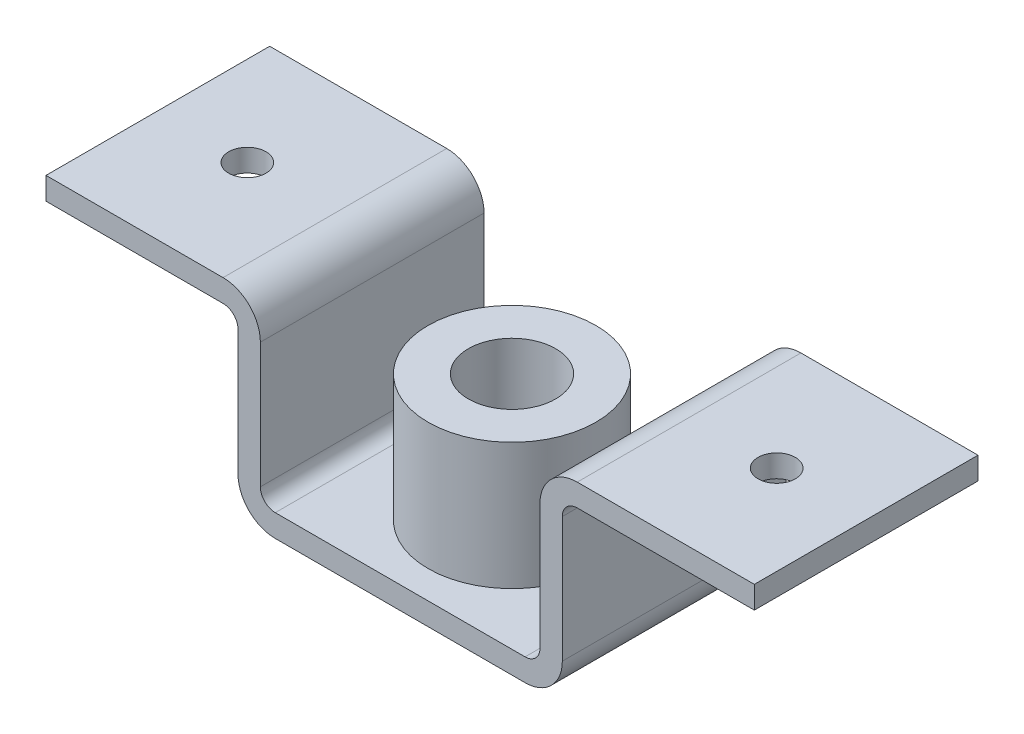
ISO-10303-21;
HEADER;
FILE_DESCRIPTION(('STEP AP214'),'2;1');
FILE_NAME('part.step','',(''),(''),'','','');
FILE_SCHEMA(('AUTOMOTIVE_DESIGN { 1 0 10303 214 1 1 1 1 }'));
ENDSEC;
DATA;
#1=APPLICATION_CONTEXT('core data for automotive mechanical design processes');
#2=APPLICATION_PROTOCOL_DEFINITION('international standard','automotive_design',2000,#1);
#3=PRODUCT_CONTEXT('',#1,'mechanical');
#4=PRODUCT('Part','Part','',(#3));
#5=PRODUCT_RELATED_PRODUCT_CATEGORY('part','',(#4));
#6=PRODUCT_DEFINITION_FORMATION('','',#4);
#7=PRODUCT_DEFINITION_CONTEXT('part definition',#1,'design');
#8=PRODUCT_DEFINITION('design','',#6,#7);
#9=PRODUCT_DEFINITION_SHAPE('','',#8);
#10=(LENGTH_UNIT() NAMED_UNIT(*) SI_UNIT(.MILLI.,.METRE.));
#11=(NAMED_UNIT(*) PLANE_ANGLE_UNIT() SI_UNIT($,.RADIAN.));
#12=(NAMED_UNIT(*) SI_UNIT($,.STERADIAN.) SOLID_ANGLE_UNIT());
#13=UNCERTAINTY_MEASURE_WITH_UNIT(LENGTH_MEASURE(1.E-05),#10,'distance_accuracy_value','');
#14=(GEOMETRIC_REPRESENTATION_CONTEXT(3) GLOBAL_UNCERTAINTY_ASSIGNED_CONTEXT((#13)) GLOBAL_UNIT_ASSIGNED_CONTEXT((#10,
#11,#12)) REPRESENTATION_CONTEXT('',''));
#15=CARTESIAN_POINT('',(0.,0.,0.));
#16=DIRECTION('',(0.,0.,1.));
#17=DIRECTION('',(1.,0.,0.));
#18=AXIS2_PLACEMENT_3D('',#15,#16,#17);
#19=CARTESIAN_POINT('',(-187.5,0.,150.));
#20=DIRECTION('',(-1.,0.,0.));
#21=DIRECTION('',(0.,0.,1.));
#22=AXIS2_PLACEMENT_3D('',#19,#20,#21);
#23=PLANE('',#22);
#24=DIRECTION('',(0.,1.,0.));
#25=VECTOR('',#24,1.);
#26=CARTESIAN_POINT('',(-187.5,0.,-150.));
#27=LINE('',#26,#25);
#28=CARTESIAN_POINT('',(-187.5,20.,-150.));
#29=VERTEX_POINT('',#28);
#30=CARTESIAN_POINT('',(-187.5,188.,-150.));
#31=VERTEX_POINT('',#30);
#32=EDGE_CURVE('E227',#29,#31,#27,.T.);
#33=ORIENTED_EDGE('',*,*,#32,.T.);
#34=DIRECTION('',(0.,0.,-1.));
#35=VECTOR('',#34,1.);
#36=CARTESIAN_POINT('',(-187.5,188.,150.));
#37=LINE('',#36,#35);
#38=CARTESIAN_POINT('',(-187.5,188.,150.));
#39=VERTEX_POINT('',#38);
#40=EDGE_CURVE('E322',#31,#39,#37,.F.);
#41=ORIENTED_EDGE('',*,*,#40,.T.);
#42=DIRECTION('',(0.,1.,0.));
#43=VECTOR('',#42,1.);
#44=CARTESIAN_POINT('',(-187.5,0.,150.));
#45=LINE('',#44,#43);
#46=CARTESIAN_POINT('',(-187.5,20.,150.));
#47=VERTEX_POINT('',#46);
#48=EDGE_CURVE('E188',#47,#39,#45,.T.);
#49=ORIENTED_EDGE('',*,*,#48,.F.);
#50=DIRECTION('',(0.,0.,-1.));
#51=VECTOR('',#50,1.);
#52=CARTESIAN_POINT('',(-187.5,20.,-150.));
#53=LINE('',#52,#51);
#54=EDGE_CURVE('E280',#47,#29,#53,.T.);
#55=ORIENTED_EDGE('',*,*,#54,.T.);
#56=EDGE_LOOP('',(#33,#41,#49,#55));
#57=FACE_BOUND('',#56,.T.);
#58=ADVANCED_FACE('F37',(#57),#23,.F.);
#59=CARTESIAN_POINT('',(-187.5,238.,150.));
#60=DIRECTION('',(0.,-1.,0.));
#61=DIRECTION('',(1.,0.,0.));
#62=AXIS2_PLACEMENT_3D('',#59,#60,#61);
#63=PLANE('',#62);
#64=CARTESIAN_POINT('',(-355.,238.,0.));
#65=DIRECTION('',(0.,1.,0.));
#66=DIRECTION('',(-1.,0.,0.));
#67=AXIS2_PLACEMENT_3D('',#64,#65,#66);
#68=CIRCLE('',#67,25.);
#69=CARTESIAN_POINT('',(-380.,238.,0.));
#70=VERTEX_POINT('',#69);
#71=EDGE_CURVE('E336',#70,#70,#68,.T.);
#72=ORIENTED_EDGE('',*,*,#71,.F.);
#73=EDGE_LOOP('',(#72));
#74=FACE_BOUND('',#73,.T.);
#75=DIRECTION('',(-1.,0.,0.));
#76=VECTOR('',#75,1.);
#77=CARTESIAN_POINT('',(-187.5,238.,150.));
#78=LINE('',#77,#76);
#79=CARTESIAN_POINT('',(-237.5,238.,150.));
#80=VERTEX_POINT('',#79);
#81=CARTESIAN_POINT('',(-475.,238.,150.));
#82=VERTEX_POINT('',#81);
#83=EDGE_CURVE('E174',#80,#82,#78,.T.);
#84=ORIENTED_EDGE('',*,*,#83,.F.);
#85=DIRECTION('',(0.,0.,-1.));
#86=VECTOR('',#85,1.);
#87=CARTESIAN_POINT('',(-237.5,238.,150.));
#88=LINE('',#87,#86);
#89=CARTESIAN_POINT('',(-237.5,238.,-150.));
#90=VERTEX_POINT('',#89);
#91=EDGE_CURVE('E320',#80,#90,#88,.T.);
#92=ORIENTED_EDGE('',*,*,#91,.T.);
#93=DIRECTION('',(-1.,0.,0.));
#94=VECTOR('',#93,1.);
#95=CARTESIAN_POINT('',(-187.5,238.,-150.));
#96=LINE('',#95,#94);
#97=CARTESIAN_POINT('',(-475.,238.,-150.));
#98=VERTEX_POINT('',#97);
#99=EDGE_CURVE('E194',#90,#98,#96,.T.);
#100=ORIENTED_EDGE('',*,*,#99,.T.);
#101=DIRECTION('',(0.,0.,-1.));
#102=VECTOR('',#101,1.);
#103=CARTESIAN_POINT('',(-475.,238.,150.));
#104=LINE('',#103,#102);
#105=EDGE_CURVE('E191',#82,#98,#104,.T.);
#106=ORIENTED_EDGE('',*,*,#105,.F.);
#107=EDGE_LOOP('',(#84,#92,#100,#106));
#108=FACE_BOUND('',#107,.T.);
#109=ADVANCED_FACE('F192',(#74,#108),#63,.F.);
#110=CARTESIAN_POINT('',(-475.,238.,150.));
#111=DIRECTION('',(1.,0.,0.));
#112=DIRECTION('',(0.,0.,-1.));
#113=AXIS2_PLACEMENT_3D('',#110,#111,#112);
#114=PLANE('',#113);
#115=DIRECTION('',(0.,-1.,0.));
#116=VECTOR('',#115,1.);
#117=CARTESIAN_POINT('',(-475.,238.,-150.));
#118=LINE('',#117,#116);
#119=CARTESIAN_POINT('',(-475.,208.,-150.));
#120=VERTEX_POINT('',#119);
#121=EDGE_CURVE('E232',#98,#120,#118,.T.);
#122=ORIENTED_EDGE('',*,*,#121,.T.);
#123=DIRECTION('',(0.,0.,-1.));
#124=VECTOR('',#123,1.);
#125=CARTESIAN_POINT('',(-475.,208.,150.));
#126=LINE('',#125,#124);
#127=CARTESIAN_POINT('',(-475.,208.,150.));
#128=VERTEX_POINT('',#127);
#129=EDGE_CURVE('E198',#128,#120,#126,.T.);
#130=ORIENTED_EDGE('',*,*,#129,.F.);
#131=DIRECTION('',(0.,-1.,0.));
#132=VECTOR('',#131,1.);
#133=CARTESIAN_POINT('',(-475.,238.,150.));
#134=LINE('',#133,#132);
#135=EDGE_CURVE('E180',#82,#128,#134,.T.);
#136=ORIENTED_EDGE('',*,*,#135,.F.);
#137=ORIENTED_EDGE('',*,*,#105,.T.);
#138=EDGE_LOOP('',(#122,#130,#136,#137));
#139=FACE_BOUND('',#138,.T.);
#140=ADVANCED_FACE('F200',(#139),#114,.F.);
#141=CARTESIAN_POINT('',(-217.5,208.,150.));
#142=DIRECTION('',(0.,1.,0.));
#143=DIRECTION('',(0.,0.,1.));
#144=AXIS2_PLACEMENT_3D('',#141,#142,#143);
#145=PLANE('',#144);
#146=CARTESIAN_POINT('',(-355.,208.,0.));
#147=DIRECTION('',(0.,1.,0.));
#148=DIRECTION('',(0.,0.,1.));
#149=AXIS2_PLACEMENT_3D('',#146,#147,#148);
#150=CIRCLE('',#149,25.);
#151=CARTESIAN_POINT('',(-355.,208.,25.));
#152=VERTEX_POINT('',#151);
#153=EDGE_CURVE('E230',#152,#152,#150,.T.);
#154=ORIENTED_EDGE('',*,*,#153,.T.);
#155=EDGE_LOOP('',(#154));
#156=FACE_BOUND('',#155,.T.);
#157=DIRECTION('',(1.,0.,0.));
#158=VECTOR('',#157,1.);
#159=CARTESIAN_POINT('',(-217.5,208.,-150.));
#160=LINE('',#159,#158);
#161=CARTESIAN_POINT('',(-237.5,208.,-150.));
#162=VERTEX_POINT('',#161);
#163=EDGE_CURVE('E234',#120,#162,#160,.T.);
#164=ORIENTED_EDGE('',*,*,#163,.T.);
#165=DIRECTION('',(0.,0.,-1.));
#166=VECTOR('',#165,1.);
#167=CARTESIAN_POINT('',(-237.5,208.,150.));
#168=LINE('',#167,#166);
#169=CARTESIAN_POINT('',(-237.5,208.,150.));
#170=VERTEX_POINT('',#169);
#171=EDGE_CURVE('E278',#162,#170,#168,.F.);
#172=ORIENTED_EDGE('',*,*,#171,.T.);
#173=DIRECTION('',(1.,0.,0.));
#174=VECTOR('',#173,1.);
#175=CARTESIAN_POINT('',(-217.5,208.,150.));
#176=LINE('',#175,#174);
#177=EDGE_CURVE('E203',#128,#170,#176,.T.);
#178=ORIENTED_EDGE('',*,*,#177,.F.);
#179=ORIENTED_EDGE('',*,*,#129,.T.);
#180=EDGE_LOOP('',(#164,#172,#178,#179));
#181=FACE_BOUND('',#180,.T.);
#182=ADVANCED_FACE('F357',(#156,#181),#145,.F.);
#183=CARTESIAN_POINT('',(-217.5,-30.,150.));
#184=DIRECTION('',(1.,0.,0.));
#185=DIRECTION('',(0.,0.,-1.));
#186=AXIS2_PLACEMENT_3D('',#183,#184,#185);
#187=PLANE('',#186);
#188=DIRECTION('',(0.,-1.,0.));
#189=VECTOR('',#188,1.);
#190=CARTESIAN_POINT('',(-217.5,-30.,-150.));
#191=LINE('',#190,#189);
#192=CARTESIAN_POINT('',(-217.5,188.,-150.));
#193=VERTEX_POINT('',#192);
#194=CARTESIAN_POINT('',(-217.5,20.,-150.));
#195=VERTEX_POINT('',#194);
#196=EDGE_CURVE('E237',#193,#195,#191,.T.);
#197=ORIENTED_EDGE('',*,*,#196,.T.);
#198=DIRECTION('',(0.,0.,-1.));
#199=VECTOR('',#198,1.);
#200=CARTESIAN_POINT('',(-217.5,20.,150.));
#201=LINE('',#200,#199);
#202=CARTESIAN_POINT('',(-217.5,20.,150.));
#203=VERTEX_POINT('',#202);
#204=EDGE_CURVE('E328',#195,#203,#201,.F.);
#205=ORIENTED_EDGE('',*,*,#204,.T.);
#206=DIRECTION('',(0.,-1.,0.));
#207=VECTOR('',#206,1.);
#208=CARTESIAN_POINT('',(-217.5,-30.,150.));
#209=LINE('',#208,#207);
#210=CARTESIAN_POINT('',(-217.5,188.,150.));
#211=VERTEX_POINT('',#210);
#212=EDGE_CURVE('E205',#211,#203,#209,.T.);
#213=ORIENTED_EDGE('',*,*,#212,.F.);
#214=DIRECTION('',(0.,0.,-1.));
#215=VECTOR('',#214,1.);
#216=CARTESIAN_POINT('',(-217.5,188.,-150.));
#217=LINE('',#216,#215);
#218=EDGE_CURVE('E275',#211,#193,#217,.T.);
#219=ORIENTED_EDGE('',*,*,#218,.T.);
#220=EDGE_LOOP('',(#197,#205,#213,#219));
#221=FACE_BOUND('',#220,.T.);
#222=ADVANCED_FACE('F366',(#221),#187,.F.);
#223=CARTESIAN_POINT('',(-217.5,-30.,150.));
#224=DIRECTION('',(0.,1.,0.));
#225=DIRECTION('',(0.,0.,1.));
#226=AXIS2_PLACEMENT_3D('',#223,#224,#225);
#227=PLANE('',#226);
#228=DIRECTION('',(1.,0.,0.));
#229=VECTOR('',#228,1.);
#230=CARTESIAN_POINT('',(-217.5,-30.,150.));
#231=LINE('',#230,#229);
#232=CARTESIAN_POINT('',(-167.5,-30.,150.));
#233=VERTEX_POINT('',#232);
#234=CARTESIAN_POINT('',(167.5,-30.,150.));
#235=VERTEX_POINT('',#234);
#236=EDGE_CURVE('E211',#233,#235,#231,.T.);
#237=ORIENTED_EDGE('',*,*,#236,.F.);
#238=DIRECTION('',(0.,0.,-1.));
#239=VECTOR('',#238,1.);
#240=CARTESIAN_POINT('',(-167.5,-30.,150.));
#241=LINE('',#240,#239);
#242=CARTESIAN_POINT('',(-167.5,-30.,-150.));
#243=VERTEX_POINT('',#242);
#244=EDGE_CURVE('E325',#233,#243,#241,.T.);
#245=ORIENTED_EDGE('',*,*,#244,.T.);
#246=DIRECTION('',(1.,0.,0.));
#247=VECTOR('',#246,1.);
#248=CARTESIAN_POINT('',(-217.5,-30.,-150.));
#249=LINE('',#248,#247);
#250=CARTESIAN_POINT('',(167.5,-30.,-150.));
#251=VERTEX_POINT('',#250);
#252=EDGE_CURVE('E240',#243,#251,#249,.T.);
#253=ORIENTED_EDGE('',*,*,#252,.T.);
#254=DIRECTION('',(0.,0.,-1.));
#255=VECTOR('',#254,1.);
#256=CARTESIAN_POINT('',(167.5,-30.,150.));
#257=LINE('',#256,#255);
#258=EDGE_CURVE('E60',#251,#235,#257,.F.);
#259=ORIENTED_EDGE('',*,*,#258,.T.);
#260=EDGE_LOOP('',(#237,#245,#253,#259));
#261=FACE_BOUND('',#260,.T.);
#262=ADVANCED_FACE('F373',(#261),#227,.F.);
#263=CARTESIAN_POINT('',(217.5,-30.,150.));
#264=DIRECTION('',(-1.,0.,0.));
#265=DIRECTION('',(0.,0.,1.));
#266=AXIS2_PLACEMENT_3D('',#263,#264,#265);
#267=PLANE('',#266);
#268=DIRECTION('',(0.,1.,0.));
#269=VECTOR('',#268,1.);
#270=CARTESIAN_POINT('',(217.5,-30.,150.));
#271=LINE('',#270,#269);
#272=CARTESIAN_POINT('',(217.5,20.,150.));
#273=VERTEX_POINT('',#272);
#274=CARTESIAN_POINT('',(217.5,188.,150.));
#275=VERTEX_POINT('',#274);
#276=EDGE_CURVE('E213',#273,#275,#271,.T.);
#277=ORIENTED_EDGE('',*,*,#276,.F.);
#278=DIRECTION('',(0.,0.,-1.));
#279=VECTOR('',#278,1.);
#280=CARTESIAN_POINT('',(217.5,20.,150.));
#281=LINE('',#280,#279);
#282=CARTESIAN_POINT('',(217.5,20.,-150.));
#283=VERTEX_POINT('',#282);
#284=EDGE_CURVE('E45',#273,#283,#281,.T.);
#285=ORIENTED_EDGE('',*,*,#284,.T.);
#286=DIRECTION('',(0.,1.,0.));
#287=VECTOR('',#286,1.);
#288=CARTESIAN_POINT('',(217.5,-30.,-150.));
#289=LINE('',#288,#287);
#290=CARTESIAN_POINT('',(217.5,188.,-150.));
#291=VERTEX_POINT('',#290);
#292=EDGE_CURVE('E242',#283,#291,#289,.T.);
#293=ORIENTED_EDGE('',*,*,#292,.T.);
#294=DIRECTION('',(0.,0.,-1.));
#295=VECTOR('',#294,1.);
#296=CARTESIAN_POINT('',(217.5,188.,150.));
#297=LINE('',#296,#295);
#298=EDGE_CURVE('E264',#291,#275,#297,.F.);
#299=ORIENTED_EDGE('',*,*,#298,.T.);
#300=EDGE_LOOP('',(#277,#285,#293,#299));
#301=FACE_BOUND('',#300,.T.);
#302=ADVANCED_FACE('F378',(#301),#267,.F.);
#303=CARTESIAN_POINT('',(217.5,208.,150.));
#304=DIRECTION('',(0.,1.,0.));
#305=DIRECTION('',(0.,0.,1.));
#306=AXIS2_PLACEMENT_3D('',#303,#304,#305);
#307=PLANE('',#306);
#308=CARTESIAN_POINT('',(355.,208.,0.));
#309=DIRECTION('',(0.,1.,0.));
#310=DIRECTION('',(0.,0.,1.));
#311=AXIS2_PLACEMENT_3D('',#308,#309,#310);
#312=CIRCLE('',#311,25.);
#313=CARTESIAN_POINT('',(355.,208.,25.));
#314=VERTEX_POINT('',#313);
#315=EDGE_CURVE('E332',#314,#314,#312,.T.);
#316=ORIENTED_EDGE('',*,*,#315,.T.);
#317=EDGE_LOOP('',(#316));
#318=FACE_BOUND('',#317,.T.);
#319=DIRECTION('',(1.,0.,0.));
#320=VECTOR('',#319,1.);
#321=CARTESIAN_POINT('',(217.5,208.,150.));
#322=LINE('',#321,#320);
#323=CARTESIAN_POINT('',(237.5,208.,150.));
#324=VERTEX_POINT('',#323);
#325=CARTESIAN_POINT('',(475.,208.,150.));
#326=VERTEX_POINT('',#325);
#327=EDGE_CURVE('E215',#324,#326,#322,.T.);
#328=ORIENTED_EDGE('',*,*,#327,.F.);
#329=DIRECTION('',(0.,0.,-1.));
#330=VECTOR('',#329,1.);
#331=CARTESIAN_POINT('',(237.5,208.,-150.));
#332=LINE('',#331,#330);
#333=CARTESIAN_POINT('',(237.5,208.,-150.));
#334=VERTEX_POINT('',#333);
#335=EDGE_CURVE('E197',#324,#334,#332,.T.);
#336=ORIENTED_EDGE('',*,*,#335,.T.);
#337=DIRECTION('',(1.,0.,0.));
#338=VECTOR('',#337,1.);
#339=CARTESIAN_POINT('',(217.5,208.,-150.));
#340=LINE('',#339,#338);
#341=CARTESIAN_POINT('',(475.,208.,-150.));
#342=VERTEX_POINT('',#341);
#343=EDGE_CURVE('E244',#334,#342,#340,.T.);
#344=ORIENTED_EDGE('',*,*,#343,.T.);
#345=DIRECTION('',(0.,0.,-1.));
#346=VECTOR('',#345,1.);
#347=CARTESIAN_POINT('',(475.,208.,150.));
#348=LINE('',#347,#346);
#349=EDGE_CURVE('E258',#326,#342,#348,.T.);
#350=ORIENTED_EDGE('',*,*,#349,.F.);
#351=EDGE_LOOP('',(#328,#336,#344,#350));
#352=FACE_BOUND('',#351,.T.);
#353=ADVANCED_FACE('F389',(#318,#352),#307,.F.);
#354=CARTESIAN_POINT('',(475.,238.,150.));
#355=DIRECTION('',(-1.,0.,0.));
#356=DIRECTION('',(0.,0.,1.));
#357=AXIS2_PLACEMENT_3D('',#354,#355,#356);
#358=PLANE('',#357);
#359=DIRECTION('',(0.,1.,0.));
#360=VECTOR('',#359,1.);
#361=CARTESIAN_POINT('',(475.,238.,-150.));
#362=LINE('',#361,#360);
#363=CARTESIAN_POINT('',(475.,238.,-150.));
#364=VERTEX_POINT('',#363);
#365=EDGE_CURVE('E246',#342,#364,#362,.T.);
#366=ORIENTED_EDGE('',*,*,#365,.T.);
#367=DIRECTION('',(0.,0.,-1.));
#368=VECTOR('',#367,1.);
#369=CARTESIAN_POINT('',(475.,238.,150.));
#370=LINE('',#369,#368);
#371=CARTESIAN_POINT('',(475.,238.,150.));
#372=VERTEX_POINT('',#371);
#373=EDGE_CURVE('E226',#372,#364,#370,.T.);
#374=ORIENTED_EDGE('',*,*,#373,.F.);
#375=DIRECTION('',(0.,1.,0.));
#376=VECTOR('',#375,1.);
#377=CARTESIAN_POINT('',(475.,238.,150.));
#378=LINE('',#377,#376);
#379=EDGE_CURVE('E217',#326,#372,#378,.T.);
#380=ORIENTED_EDGE('',*,*,#379,.F.);
#381=ORIENTED_EDGE('',*,*,#349,.T.);
#382=EDGE_LOOP('',(#366,#374,#380,#381));
#383=FACE_BOUND('',#382,.T.);
#384=ADVANCED_FACE('F393',(#383),#358,.F.);
#385=CARTESIAN_POINT('',(187.5,238.,150.));
#386=DIRECTION('',(0.,-1.,0.));
#387=DIRECTION('',(1.,0.,0.));
#388=AXIS2_PLACEMENT_3D('',#385,#386,#387);
#389=PLANE('',#388);
#390=CARTESIAN_POINT('',(355.,238.,0.));
#391=DIRECTION('',(0.,1.,0.));
#392=DIRECTION('',(1.,0.,0.));
#393=AXIS2_PLACEMENT_3D('',#390,#391,#392);
#394=CIRCLE('',#393,25.);
#395=CARTESIAN_POINT('',(380.,238.,0.));
#396=VERTEX_POINT('',#395);
#397=EDGE_CURVE('E341',#396,#396,#394,.T.);
#398=ORIENTED_EDGE('',*,*,#397,.F.);
#399=EDGE_LOOP('',(#398));
#400=FACE_BOUND('',#399,.T.);
#401=DIRECTION('',(-1.,0.,0.));
#402=VECTOR('',#401,1.);
#403=CARTESIAN_POINT('',(187.5,238.,-150.));
#404=LINE('',#403,#402);
#405=CARTESIAN_POINT('',(237.5,238.,-150.));
#406=VERTEX_POINT('',#405);
#407=EDGE_CURVE('E248',#364,#406,#404,.T.);
#408=ORIENTED_EDGE('',*,*,#407,.T.);
#409=DIRECTION('',(0.,0.,-1.));
#410=VECTOR('',#409,1.);
#411=CARTESIAN_POINT('',(237.5,238.,150.));
#412=LINE('',#411,#410);
#413=CARTESIAN_POINT('',(237.5,238.,150.));
#414=VERTEX_POINT('',#413);
#415=EDGE_CURVE('E312',#406,#414,#412,.F.);
#416=ORIENTED_EDGE('',*,*,#415,.T.);
#417=DIRECTION('',(-1.,0.,0.));
#418=VECTOR('',#417,1.);
#419=CARTESIAN_POINT('',(187.5,238.,150.));
#420=LINE('',#419,#418);
#421=EDGE_CURVE('E219',#372,#414,#420,.T.);
#422=ORIENTED_EDGE('',*,*,#421,.F.);
#423=ORIENTED_EDGE('',*,*,#373,.T.);
#424=EDGE_LOOP('',(#408,#416,#422,#423));
#425=FACE_BOUND('',#424,.T.);
#426=ADVANCED_FACE('F468',(#400,#425),#389,.F.);
#427=CARTESIAN_POINT('',(187.5,0.,150.));
#428=DIRECTION('',(1.,0.,0.));
#429=DIRECTION('',(0.,0.,-1.));
#430=AXIS2_PLACEMENT_3D('',#427,#428,#429);
#431=PLANE('',#430);
#432=DIRECTION('',(0.,-1.,0.));
#433=VECTOR('',#432,1.);
#434=CARTESIAN_POINT('',(187.5,0.,150.));
#435=LINE('',#434,#433);
#436=CARTESIAN_POINT('',(187.5,188.,150.));
#437=VERTEX_POINT('',#436);
#438=CARTESIAN_POINT('',(187.5,20.,150.));
#439=VERTEX_POINT('',#438);
#440=EDGE_CURVE('E221',#437,#439,#435,.T.);
#441=ORIENTED_EDGE('',*,*,#440,.F.);
#442=DIRECTION('',(0.,0.,-1.));
#443=VECTOR('',#442,1.);
#444=CARTESIAN_POINT('',(187.5,188.,150.));
#445=LINE('',#444,#443);
#446=CARTESIAN_POINT('',(187.5,188.,-150.));
#447=VERTEX_POINT('',#446);
#448=EDGE_CURVE('E301',#437,#447,#445,.T.);
#449=ORIENTED_EDGE('',*,*,#448,.T.);
#450=DIRECTION('',(0.,-1.,0.));
#451=VECTOR('',#450,1.);
#452=CARTESIAN_POINT('',(187.5,0.,-150.));
#453=LINE('',#452,#451);
#454=CARTESIAN_POINT('',(187.5,20.,-150.));
#455=VERTEX_POINT('',#454);
#456=EDGE_CURVE('E251',#447,#455,#453,.T.);
#457=ORIENTED_EDGE('',*,*,#456,.T.);
#458=DIRECTION('',(0.,0.,-1.));
#459=VECTOR('',#458,1.);
#460=CARTESIAN_POINT('',(187.5,20.,150.));
#461=LINE('',#460,#459);
#462=EDGE_CURVE('E272',#455,#439,#461,.F.);
#463=ORIENTED_EDGE('',*,*,#462,.T.);
#464=EDGE_LOOP('',(#441,#449,#457,#463));
#465=FACE_BOUND('',#464,.T.);
#466=ADVANCED_FACE('F403',(#465),#431,.F.);
#467=CARTESIAN_POINT('',(-187.5,0.,150.));
#468=DIRECTION('',(0.,-1.,0.));
#469=DIRECTION('',(0.,0.,-1.));
#470=AXIS2_PLACEMENT_3D('',#467,#468,#469);
#471=PLANE('',#470);
#472=CARTESIAN_POINT('',(0.,0.,0.));
#473=DIRECTION('',(0.,-1.,0.));
#474=DIRECTION('',(0.,0.,-1.));
#475=AXIS2_PLACEMENT_3D('',#472,#473,#474);
#476=CIRCLE('',#475,112.5);
#477=CARTESIAN_POINT('',(0.,0.,-112.5));
#478=VERTEX_POINT('',#477);
#479=EDGE_CURVE('E11',#478,#478,#476,.F.);
#480=ORIENTED_EDGE('',*,*,#479,.F.);
#481=EDGE_LOOP('',(#480));
#482=FACE_BOUND('',#481,.T.);
#483=DIRECTION('',(-1.,0.,0.));
#484=VECTOR('',#483,1.);
#485=CARTESIAN_POINT('',(-187.5,0.,150.));
#486=LINE('',#485,#484);
#487=CARTESIAN_POINT('',(167.5,0.,150.));
#488=VERTEX_POINT('',#487);
#489=CARTESIAN_POINT('',(-167.5,0.,150.));
#490=VERTEX_POINT('',#489);
#491=EDGE_CURVE('E223',#488,#490,#486,.T.);
#492=ORIENTED_EDGE('',*,*,#491,.F.);
#493=DIRECTION('',(0.,0.,-1.));
#494=VECTOR('',#493,1.);
#495=CARTESIAN_POINT('',(167.5,0.,-150.));
#496=LINE('',#495,#494);
#497=CARTESIAN_POINT('',(167.5,0.,-150.));
#498=VERTEX_POINT('',#497);
#499=EDGE_CURVE('E269',#488,#498,#496,.T.);
#500=ORIENTED_EDGE('',*,*,#499,.T.);
#501=DIRECTION('',(-1.,0.,0.));
#502=VECTOR('',#501,1.);
#503=CARTESIAN_POINT('',(-187.5,0.,-150.));
#504=LINE('',#503,#502);
#505=CARTESIAN_POINT('',(-167.5,0.,-150.));
#506=VERTEX_POINT('',#505);
#507=EDGE_CURVE('E253',#498,#506,#504,.T.);
#508=ORIENTED_EDGE('',*,*,#507,.T.);
#509=DIRECTION('',(0.,0.,-1.));
#510=VECTOR('',#509,1.);
#511=CARTESIAN_POINT('',(-167.5,0.,150.));
#512=LINE('',#511,#510);
#513=EDGE_CURVE('E267',#506,#490,#512,.F.);
#514=ORIENTED_EDGE('',*,*,#513,.T.);
#515=EDGE_LOOP('',(#492,#500,#508,#514));
#516=FACE_BOUND('',#515,.T.);
#517=ADVANCED_FACE('F413',(#482,#516),#471,.F.);
#518=CARTESIAN_POINT('',(0.,0.,150.));
#519=DIRECTION('',(0.,0.,1.));
#520=DIRECTION('',(1.,0.,0.));
#521=AXIS2_PLACEMENT_3D('',#518,#519,#520);
#522=PLANE('',#521);
#523=ORIENTED_EDGE('',*,*,#421,.T.);
#524=CARTESIAN_POINT('',(237.5,188.,150.));
#525=DIRECTION('',(0.,0.,1.));
#526=DIRECTION('',(1.,0.,0.));
#527=AXIS2_PLACEMENT_3D('',#524,#525,#526);
#528=CIRCLE('',#527,50.);
#529=EDGE_CURVE('E318',#414,#437,#528,.T.);
#530=ORIENTED_EDGE('',*,*,#529,.T.);
#531=ORIENTED_EDGE('',*,*,#440,.T.);
#532=CARTESIAN_POINT('',(167.5,20.,150.));
#533=DIRECTION('',(0.,0.,1.));
#534=DIRECTION('',(1.,0.,0.));
#535=AXIS2_PLACEMENT_3D('',#532,#533,#534);
#536=CIRCLE('',#535,20.);
#537=EDGE_CURVE('E291',#439,#488,#536,.F.);
#538=ORIENTED_EDGE('',*,*,#537,.T.);
#539=ORIENTED_EDGE('',*,*,#491,.T.);
#540=CARTESIAN_POINT('',(-167.5,20.,150.));
#541=DIRECTION('',(0.,0.,1.));
#542=DIRECTION('',(1.,0.,0.));
#543=AXIS2_PLACEMENT_3D('',#540,#541,#542);
#544=CIRCLE('',#543,20.);
#545=EDGE_CURVE('E299',#490,#47,#544,.F.);
#546=ORIENTED_EDGE('',*,*,#545,.T.);
#547=ORIENTED_EDGE('',*,*,#48,.T.);
#548=CARTESIAN_POINT('',(-237.5,188.,150.));
#549=DIRECTION('',(0.,0.,1.));
#550=DIRECTION('',(1.,0.,0.));
#551=AXIS2_PLACEMENT_3D('',#548,#549,#550);
#552=CIRCLE('',#551,50.);
#553=EDGE_CURVE('E184',#39,#80,#552,.T.);
#554=ORIENTED_EDGE('',*,*,#553,.T.);
#555=ORIENTED_EDGE('',*,*,#83,.T.);
#556=ORIENTED_EDGE('',*,*,#135,.T.);
#557=ORIENTED_EDGE('',*,*,#177,.T.);
#558=CARTESIAN_POINT('',(-237.5,188.,150.));
#559=DIRECTION('',(0.,0.,1.));
#560=DIRECTION('',(1.,0.,0.));
#561=AXIS2_PLACEMENT_3D('',#558,#559,#560);
#562=CIRCLE('',#561,20.);
#563=EDGE_CURVE('E295',#170,#211,#562,.F.);
#564=ORIENTED_EDGE('',*,*,#563,.T.);
#565=ORIENTED_EDGE('',*,*,#212,.T.);
#566=CARTESIAN_POINT('',(-167.5,20.,150.));
#567=DIRECTION('',(0.,0.,1.));
#568=DIRECTION('',(1.,0.,0.));
#569=AXIS2_PLACEMENT_3D('',#566,#567,#568);
#570=CIRCLE('',#569,50.);
#571=EDGE_CURVE('E315',#203,#233,#570,.T.);
#572=ORIENTED_EDGE('',*,*,#571,.T.);
#573=ORIENTED_EDGE('',*,*,#236,.T.);
#574=CARTESIAN_POINT('',(167.5,20.,150.));
#575=DIRECTION('',(0.,0.,1.));
#576=DIRECTION('',(1.,0.,0.));
#577=AXIS2_PLACEMENT_3D('',#574,#575,#576);
#578=CIRCLE('',#577,50.);
#579=EDGE_CURVE('E52',#235,#273,#578,.T.);
#580=ORIENTED_EDGE('',*,*,#579,.T.);
#581=ORIENTED_EDGE('',*,*,#276,.T.);
#582=CARTESIAN_POINT('',(237.5,188.,150.));
#583=DIRECTION('',(0.,0.,1.));
#584=DIRECTION('',(1.,0.,0.));
#585=AXIS2_PLACEMENT_3D('',#582,#583,#584);
#586=CIRCLE('',#585,20.);
#587=EDGE_CURVE('E286',#275,#324,#586,.F.);
#588=ORIENTED_EDGE('',*,*,#587,.T.);
#589=ORIENTED_EDGE('',*,*,#327,.T.);
#590=ORIENTED_EDGE('',*,*,#379,.T.);
#591=EDGE_LOOP('',(#523,#530,#531,#538,#539,#546,#547,#554,#555,#556,#557,#564,#565,#572,#573,
#580,#581,#588,#589,#590));
#592=FACE_BOUND('',#591,.T.);
#593=ADVANCED_FACE('F177',(#592),#522,.T.);
#594=CARTESIAN_POINT('',(0.,0.,-150.));
#595=DIRECTION('',(0.,0.,1.));
#596=DIRECTION('',(1.,0.,0.));
#597=AXIS2_PLACEMENT_3D('',#594,#595,#596);
#598=PLANE('',#597);
#599=ORIENTED_EDGE('',*,*,#456,.F.);
#600=CARTESIAN_POINT('',(237.5,188.,-150.));
#601=DIRECTION('',(0.,0.,1.));
#602=DIRECTION('',(1.,0.,0.));
#603=AXIS2_PLACEMENT_3D('',#600,#601,#602);
#604=CIRCLE('',#603,50.);
#605=EDGE_CURVE('E310',#447,#406,#604,.F.);
#606=ORIENTED_EDGE('',*,*,#605,.T.);
#607=ORIENTED_EDGE('',*,*,#407,.F.);
#608=ORIENTED_EDGE('',*,*,#365,.F.);
#609=ORIENTED_EDGE('',*,*,#343,.F.);
#610=CARTESIAN_POINT('',(237.5,188.,-150.));
#611=DIRECTION('',(0.,0.,1.));
#612=DIRECTION('',(1.,0.,0.));
#613=AXIS2_PLACEMENT_3D('',#610,#611,#612);
#614=CIRCLE('',#613,20.);
#615=EDGE_CURVE('E283',#334,#291,#614,.T.);
#616=ORIENTED_EDGE('',*,*,#615,.T.);
#617=ORIENTED_EDGE('',*,*,#292,.F.);
#618=CARTESIAN_POINT('',(167.5,20.,-150.));
#619=DIRECTION('',(0.,0.,1.));
#620=DIRECTION('',(1.,0.,0.));
#621=AXIS2_PLACEMENT_3D('',#618,#619,#620);
#622=CIRCLE('',#621,50.);
#623=EDGE_CURVE('E304',#283,#251,#622,.F.);
#624=ORIENTED_EDGE('',*,*,#623,.T.);
#625=ORIENTED_EDGE('',*,*,#252,.F.);
#626=CARTESIAN_POINT('',(-167.5,20.,-150.));
#627=DIRECTION('',(0.,0.,1.));
#628=DIRECTION('',(1.,0.,0.));
#629=AXIS2_PLACEMENT_3D('',#626,#627,#628);
#630=CIRCLE('',#629,50.);
#631=EDGE_CURVE('E306',#243,#195,#630,.F.);
#632=ORIENTED_EDGE('',*,*,#631,.T.);
#633=ORIENTED_EDGE('',*,*,#196,.F.);
#634=CARTESIAN_POINT('',(-237.5,188.,-150.));
#635=DIRECTION('',(0.,0.,1.));
#636=DIRECTION('',(1.,0.,0.));
#637=AXIS2_PLACEMENT_3D('',#634,#635,#636);
#638=CIRCLE('',#637,20.);
#639=EDGE_CURVE('E293',#193,#162,#638,.T.);
#640=ORIENTED_EDGE('',*,*,#639,.T.);
#641=ORIENTED_EDGE('',*,*,#163,.F.);
#642=ORIENTED_EDGE('',*,*,#121,.F.);
#643=ORIENTED_EDGE('',*,*,#99,.F.);
#644=CARTESIAN_POINT('',(-237.5,188.,-150.));
#645=DIRECTION('',(0.,0.,1.));
#646=DIRECTION('',(1.,0.,0.));
#647=AXIS2_PLACEMENT_3D('',#644,#645,#646);
#648=CIRCLE('',#647,50.);
#649=EDGE_CURVE('E308',#90,#31,#648,.F.);
#650=ORIENTED_EDGE('',*,*,#649,.T.);
#651=ORIENTED_EDGE('',*,*,#32,.F.);
#652=CARTESIAN_POINT('',(-167.5,20.,-150.));
#653=DIRECTION('',(0.,0.,1.));
#654=DIRECTION('',(1.,0.,0.));
#655=AXIS2_PLACEMENT_3D('',#652,#653,#654);
#656=CIRCLE('',#655,20.);
#657=EDGE_CURVE('E297',#29,#506,#656,.T.);
#658=ORIENTED_EDGE('',*,*,#657,.T.);
#659=ORIENTED_EDGE('',*,*,#507,.F.);
#660=CARTESIAN_POINT('',(167.5,20.,-150.));
#661=DIRECTION('',(0.,0.,1.));
#662=DIRECTION('',(1.,0.,0.));
#663=AXIS2_PLACEMENT_3D('',#660,#661,#662);
#664=CIRCLE('',#663,20.);
#665=EDGE_CURVE('E288',#498,#455,#664,.T.);
#666=ORIENTED_EDGE('',*,*,#665,.T.);
#667=EDGE_LOOP('',(#599,#606,#607,#608,#609,#616,#617,#624,#625,#632,#633,#640,#641,#642,#643,
#650,#651,#658,#659,#666));
#668=FACE_BOUND('',#667,.T.);
#669=ADVANCED_FACE('F353',(#668),#598,.F.);
#670=CARTESIAN_POINT('',(237.5,188.,150.));
#671=DIRECTION('',(0.,0.,1.));
#672=DIRECTION('',(1.,0.,0.));
#673=AXIS2_PLACEMENT_3D('',#670,#671,#672);
#674=CYLINDRICAL_SURFACE('',#673,20.);
#675=ORIENTED_EDGE('',*,*,#587,.F.);
#676=ORIENTED_EDGE('',*,*,#298,.F.);
#677=ORIENTED_EDGE('',*,*,#615,.F.);
#678=ORIENTED_EDGE('',*,*,#335,.F.);
#679=EDGE_LOOP('',(#675,#676,#677,#678));
#680=FACE_BOUND('',#679,.T.);
#681=ADVANCED_FACE('F385',(#680),#674,.F.);
#682=CARTESIAN_POINT('',(167.5,20.,150.));
#683=DIRECTION('',(0.,0.,1.));
#684=DIRECTION('',(1.,0.,0.));
#685=AXIS2_PLACEMENT_3D('',#682,#683,#684);
#686=CYLINDRICAL_SURFACE('',#685,20.);
#687=ORIENTED_EDGE('',*,*,#537,.F.);
#688=ORIENTED_EDGE('',*,*,#462,.F.);
#689=ORIENTED_EDGE('',*,*,#665,.F.);
#690=ORIENTED_EDGE('',*,*,#499,.F.);
#691=EDGE_LOOP('',(#687,#688,#689,#690));
#692=FACE_BOUND('',#691,.T.);
#693=ADVANCED_FACE('F410',(#692),#686,.F.);
#694=CARTESIAN_POINT('',(-237.5,188.,150.));
#695=DIRECTION('',(0.,0.,1.));
#696=DIRECTION('',(1.,0.,0.));
#697=AXIS2_PLACEMENT_3D('',#694,#695,#696);
#698=CYLINDRICAL_SURFACE('',#697,20.);
#699=ORIENTED_EDGE('',*,*,#563,.F.);
#700=ORIENTED_EDGE('',*,*,#171,.F.);
#701=ORIENTED_EDGE('',*,*,#639,.F.);
#702=ORIENTED_EDGE('',*,*,#218,.F.);
#703=EDGE_LOOP('',(#699,#700,#701,#702));
#704=FACE_BOUND('',#703,.T.);
#705=ADVANCED_FACE('F363',(#704),#698,.F.);
#706=CARTESIAN_POINT('',(-167.5,20.,150.));
#707=DIRECTION('',(0.,0.,1.));
#708=DIRECTION('',(1.,0.,0.));
#709=AXIS2_PLACEMENT_3D('',#706,#707,#708);
#710=CYLINDRICAL_SURFACE('',#709,20.);
#711=ORIENTED_EDGE('',*,*,#545,.F.);
#712=ORIENTED_EDGE('',*,*,#513,.F.);
#713=ORIENTED_EDGE('',*,*,#657,.F.);
#714=ORIENTED_EDGE('',*,*,#54,.F.);
#715=EDGE_LOOP('',(#711,#712,#713,#714));
#716=FACE_BOUND('',#715,.T.);
#717=ADVANCED_FACE('F416',(#716),#710,.F.);
#718=CARTESIAN_POINT('',(237.5,188.,150.));
#719=DIRECTION('',(0.,0.,-1.));
#720=DIRECTION('',(-1.,0.,0.));
#721=AXIS2_PLACEMENT_3D('',#718,#719,#720);
#722=CYLINDRICAL_SURFACE('',#721,50.);
#723=ORIENTED_EDGE('',*,*,#529,.F.);
#724=ORIENTED_EDGE('',*,*,#415,.F.);
#725=ORIENTED_EDGE('',*,*,#605,.F.);
#726=ORIENTED_EDGE('',*,*,#448,.F.);
#727=EDGE_LOOP('',(#723,#724,#725,#726));
#728=FACE_BOUND('',#727,.T.);
#729=ADVANCED_FACE('F401',(#728),#722,.T.);
#730=CARTESIAN_POINT('',(-237.5,188.,150.));
#731=DIRECTION('',(0.,0.,-1.));
#732=DIRECTION('',(-1.,0.,0.));
#733=AXIS2_PLACEMENT_3D('',#730,#731,#732);
#734=CYLINDRICAL_SURFACE('',#733,50.);
#735=ORIENTED_EDGE('',*,*,#553,.F.);
#736=ORIENTED_EDGE('',*,*,#40,.F.);
#737=ORIENTED_EDGE('',*,*,#649,.F.);
#738=ORIENTED_EDGE('',*,*,#91,.F.);
#739=EDGE_LOOP('',(#735,#736,#737,#738));
#740=FACE_BOUND('',#739,.T.);
#741=ADVANCED_FACE('F350',(#740),#734,.T.);
#742=CARTESIAN_POINT('',(-167.5,20.,150.));
#743=DIRECTION('',(0.,0.,-1.));
#744=DIRECTION('',(-1.,0.,0.));
#745=AXIS2_PLACEMENT_3D('',#742,#743,#744);
#746=CYLINDRICAL_SURFACE('',#745,50.);
#747=ORIENTED_EDGE('',*,*,#571,.F.);
#748=ORIENTED_EDGE('',*,*,#204,.F.);
#749=ORIENTED_EDGE('',*,*,#631,.F.);
#750=ORIENTED_EDGE('',*,*,#244,.F.);
#751=EDGE_LOOP('',(#747,#748,#749,#750));
#752=FACE_BOUND('',#751,.T.);
#753=ADVANCED_FACE('F372',(#752),#746,.T.);
#754=CARTESIAN_POINT('',(167.5,20.,150.));
#755=DIRECTION('',(0.,0.,-1.));
#756=DIRECTION('',(-1.,0.,0.));
#757=AXIS2_PLACEMENT_3D('',#754,#755,#756);
#758=CYLINDRICAL_SURFACE('',#757,50.);
#759=ORIENTED_EDGE('',*,*,#579,.F.);
#760=ORIENTED_EDGE('',*,*,#258,.F.);
#761=ORIENTED_EDGE('',*,*,#623,.F.);
#762=ORIENTED_EDGE('',*,*,#284,.F.);
#763=EDGE_LOOP('',(#759,#760,#761,#762));
#764=FACE_BOUND('',#763,.T.);
#765=ADVANCED_FACE('F39',(#764),#758,.T.);
#766=CARTESIAN_POINT('',(355.,-30.,0.));
#767=DIRECTION('',(0.,1.,0.));
#768=DIRECTION('',(-1.,0.,0.));
#769=AXIS2_PLACEMENT_3D('',#766,#767,#768);
#770=CYLINDRICAL_SURFACE('',#769,25.);
#771=ORIENTED_EDGE('',*,*,#397,.T.);
#772=EDGE_LOOP('',(#771));
#773=FACE_BOUND('',#772,.T.);
#774=ORIENTED_EDGE('',*,*,#315,.F.);
#775=EDGE_LOOP('',(#774));
#776=FACE_BOUND('',#775,.T.);
#777=ADVANCED_FACE('F441',(#773,#776),#770,.F.);
#778=CARTESIAN_POINT('',(-355.,-30.,0.));
#779=DIRECTION('',(0.,1.,0.));
#780=DIRECTION('',(-1.,0.,0.));
#781=AXIS2_PLACEMENT_3D('',#778,#779,#780);
#782=CYLINDRICAL_SURFACE('',#781,25.);
#783=ORIENTED_EDGE('',*,*,#71,.T.);
#784=EDGE_LOOP('',(#783));
#785=FACE_BOUND('',#784,.T.);
#786=ORIENTED_EDGE('',*,*,#153,.F.);
#787=EDGE_LOOP('',(#786));
#788=FACE_BOUND('',#787,.T.);
#789=ADVANCED_FACE('F445',(#785,#788),#782,.F.);
#790=CARTESIAN_POINT('',(0.,170.,0.));
#791=DIRECTION('',(0.,1.,0.));
#792=DIRECTION('',(0.,0.,1.));
#793=AXIS2_PLACEMENT_3D('',#790,#791,#792);
#794=PLANE('',#793);
#795=CARTESIAN_POINT('',(0.,170.,0.));
#796=DIRECTION('',(0.,1.,0.));
#797=DIRECTION('',(0.,0.,1.));
#798=AXIS2_PLACEMENT_3D('',#795,#796,#797);
#799=CIRCLE('',#798,112.5);
#800=CARTESIAN_POINT('',(0.,170.,112.5));
#801=VERTEX_POINT('',#800);
#802=EDGE_CURVE('E718',#801,#801,#799,.T.);
#803=ORIENTED_EDGE('',*,*,#802,.T.);
#804=EDGE_LOOP('',(#803));
#805=FACE_BOUND('',#804,.T.);
#806=CARTESIAN_POINT('',(0.,170.,0.));
#807=DIRECTION('',(0.,1.,0.));
#808=DIRECTION('',(0.,0.,1.));
#809=AXIS2_PLACEMENT_3D('',#806,#807,#808);
#810=CIRCLE('',#809,58.5);
#811=CARTESIAN_POINT('',(0.,170.,58.5));
#812=VERTEX_POINT('',#811);
#813=EDGE_CURVE('E713',#812,#812,#810,.T.);
#814=ORIENTED_EDGE('',*,*,#813,.F.);
#815=EDGE_LOOP('',(#814));
#816=FACE_BOUND('',#815,.T.);
#817=ADVANCED_FACE('F451',(#805,#816),#794,.T.);
#818=CARTESIAN_POINT('',(0.,170.,0.));
#819=DIRECTION('',(0.,-1.,0.));
#820=DIRECTION('',(0.,0.,-1.));
#821=AXIS2_PLACEMENT_3D('',#818,#819,#820);
#822=CYLINDRICAL_SURFACE('',#821,112.5);
#823=ORIENTED_EDGE('',*,*,#802,.F.);
#824=EDGE_LOOP('',(#823));
#825=FACE_BOUND('',#824,.T.);
#826=ORIENTED_EDGE('',*,*,#479,.T.);
#827=EDGE_LOOP('',(#826));
#828=FACE_BOUND('',#827,.T.);
#829=ADVANCED_FACE('F680',(#825,#828),#822,.T.);
#830=CARTESIAN_POINT('',(0.,170.,0.));
#831=DIRECTION('',(0.,-1.,0.));
#832=DIRECTION('',(0.,0.,-1.));
#833=AXIS2_PLACEMENT_3D('',#830,#831,#832);
#834=CYLINDRICAL_SURFACE('',#833,58.5);
#835=ORIENTED_EDGE('',*,*,#813,.T.);
#836=EDGE_LOOP('',(#835));
#837=FACE_BOUND('',#836,.T.);
#838=CARTESIAN_POINT('',(0.,0.,0.));
#839=DIRECTION('',(0.,1.,0.));
#840=DIRECTION('',(0.,0.,1.));
#841=AXIS2_PLACEMENT_3D('',#838,#839,#840);
#842=CIRCLE('',#841,58.5);
#843=CARTESIAN_POINT('',(0.,0.,58.5));
#844=VERTEX_POINT('',#843);
#845=EDGE_CURVE('E716',#844,#844,#842,.T.);
#846=ORIENTED_EDGE('',*,*,#845,.F.);
#847=EDGE_LOOP('',(#846));
#848=FACE_BOUND('',#847,.T.);
#849=ADVANCED_FACE('F670',(#837,#848),#834,.F.);
#850=ORIENTED_EDGE('',*,*,#845,.T.);
#851=EDGE_LOOP('',(#850));
#852=FACE_BOUND('',#851,.T.);
#853=ADVANCED_FACE('F465',(#852),#471,.F.);
#854=CLOSED_SHELL('',(#58,#109,#140,#182,#222,#262,#302,#353,#384,#426,#466,#517,#593,#669,#681,
#693,#705,#717,#729,#741,#753,#765,#777,#789,#817,#829,#849,#853));
#855=MANIFOLD_SOLID_BREP('B2',#854);
#856=ADVANCED_BREP_SHAPE_REPRESENTATION('',(#18,#855),#14);
#857=SHAPE_DEFINITION_REPRESENTATION(#9,#856);
ENDSEC;
END-ISO-10303-21;
